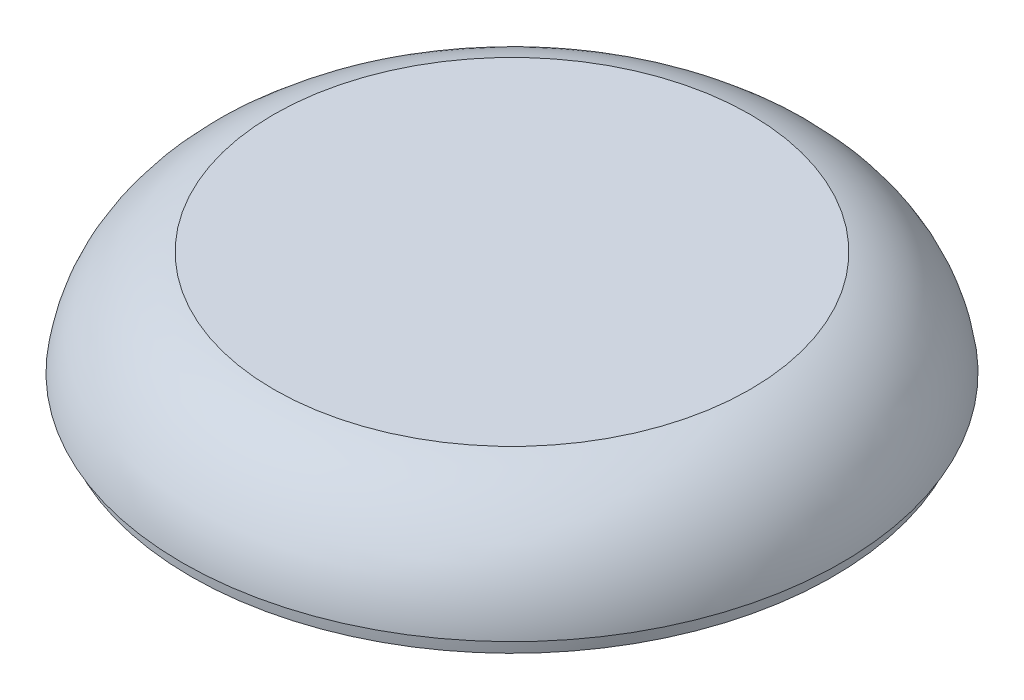
ISO-10303-21;
HEADER;
FILE_DESCRIPTION(('STEP AP214'),'2;1');
FILE_NAME('part.step','',(''),(''),'','','');
FILE_SCHEMA(('AUTOMOTIVE_DESIGN { 1 0 10303 214 1 1 1 1 }'));
ENDSEC;
DATA;
#1=APPLICATION_CONTEXT('core data for automotive mechanical design processes');
#2=APPLICATION_PROTOCOL_DEFINITION('international standard','automotive_design',2000,#1);
#3=PRODUCT_CONTEXT('',#1,'mechanical');
#4=PRODUCT('Part','Part','',(#3));
#5=PRODUCT_RELATED_PRODUCT_CATEGORY('part','',(#4));
#6=PRODUCT_DEFINITION_FORMATION('','',#4);
#7=PRODUCT_DEFINITION_CONTEXT('part definition',#1,'design');
#8=PRODUCT_DEFINITION('design','',#6,#7);
#9=PRODUCT_DEFINITION_SHAPE('','',#8);
#10=(LENGTH_UNIT() NAMED_UNIT(*) SI_UNIT(.MILLI.,.METRE.));
#11=(NAMED_UNIT(*) PLANE_ANGLE_UNIT() SI_UNIT($,.RADIAN.));
#12=(NAMED_UNIT(*) SI_UNIT($,.STERADIAN.) SOLID_ANGLE_UNIT());
#13=UNCERTAINTY_MEASURE_WITH_UNIT(LENGTH_MEASURE(1.E-05),#10,'distance_accuracy_value','');
#14=(GEOMETRIC_REPRESENTATION_CONTEXT(3) GLOBAL_UNCERTAINTY_ASSIGNED_CONTEXT((#13)) GLOBAL_UNIT_ASSIGNED_CONTEXT((#10,
#11,#12)) REPRESENTATION_CONTEXT('',''));
#15=CARTESIAN_POINT('',(0.,0.,0.));
#16=DIRECTION('',(0.,0.,1.));
#17=DIRECTION('',(1.,0.,0.));
#18=AXIS2_PLACEMENT_3D('',#15,#16,#17);
#19=CARTESIAN_POINT('',(41.,-2.,0.));
#20=DIRECTION('',(0.,1.,0.));
#21=DIRECTION('',(0.,0.,1.));
#22=AXIS2_PLACEMENT_3D('',#19,#20,#21);
#23=TOROIDAL_SURFACE('',#22,25.5944940368041,15.5347872203666);
#24=CARTESIAN_POINT('',(41.,0.,0.));
#25=DIRECTION('',(0.,1.,0.));
#26=DIRECTION('',(0.,0.,1.));
#27=AXIS2_PLACEMENT_3D('',#24,#25,#26);
#28=CIRCLE('',#27,41.);
#29=CARTESIAN_POINT('',(41.,0.,41.));
#30=VERTEX_POINT('',#29);
#31=EDGE_CURVE('E10',#30,#30,#28,.T.);
#32=ORIENTED_EDGE('',*,*,#31,.T.);
#33=EDGE_LOOP('',(#32));
#34=FACE_BOUND('',#33,.T.);
#35=CARTESIAN_POINT('',(41.,13.,0.));
#36=DIRECTION('',(0.,1.,0.));
#37=DIRECTION('',(0.,0.,1.));
#38=AXIS2_PLACEMENT_3D('',#35,#36,#37);
#39=CIRCLE('',#38,29.6354857445492);
#40=CARTESIAN_POINT('',(41.,13.,29.6354857445492));
#41=VERTEX_POINT('',#40);
#42=EDGE_CURVE('E70',#41,#41,#39,.T.);
#43=ORIENTED_EDGE('',*,*,#42,.F.);
#44=EDGE_LOOP('',(#43));
#45=FACE_BOUND('',#44,.T.);
#46=ADVANCED_FACE('F39',(#34,#45),#23,.T.);
#47=CARTESIAN_POINT('',(0.,0.,0.));
#48=DIRECTION('',(0.,-1.,0.));
#49=DIRECTION('',(0.,0.,-1.));
#50=AXIS2_PLACEMENT_3D('',#47,#48,#49);
#51=PLANE('',#50);
#52=CARTESIAN_POINT('',(41.,0.,0.));
#53=DIRECTION('',(0.,1.,0.));
#54=DIRECTION('',(0.,0.,1.));
#55=AXIS2_PLACEMENT_3D('',#52,#53,#54);
#56=CIRCLE('',#55,40.);
#57=CARTESIAN_POINT('',(41.,0.,40.));
#58=VERTEX_POINT('',#57);
#59=EDGE_CURVE('E46',#58,#58,#56,.T.);
#60=ORIENTED_EDGE('',*,*,#59,.T.);
#61=EDGE_LOOP('',(#60));
#62=FACE_BOUND('',#61,.T.);
#63=ORIENTED_EDGE('',*,*,#31,.F.);
#64=EDGE_LOOP('',(#63));
#65=FACE_BOUND('',#64,.T.);
#66=ADVANCED_FACE('F78',(#62,#65),#51,.T.);
#67=CARTESIAN_POINT('',(41.,0.,0.));
#68=DIRECTION('',(0.,1.,0.));
#69=DIRECTION('',(-1.,0.,0.));
#70=AXIS2_PLACEMENT_3D('',#67,#68,#69);
#71=SPHERICAL_SURFACE('',#70,40.);
#72=CARTESIAN_POINT('',(41.,-1.99999999999999,0.));
#73=DIRECTION('',(0.,1.,0.));
#74=DIRECTION('',(0.,0.,1.));
#75=AXIS2_PLACEMENT_3D('',#72,#73,#74);
#76=CIRCLE('',#75,39.9499687108764);
#77=CARTESIAN_POINT('',(41.,-1.99999999999999,39.9499687108764));
#78=VERTEX_POINT('',#77);
#79=EDGE_CURVE('E51',#78,#78,#76,.T.);
#80=ORIENTED_EDGE('',*,*,#79,.T.);
#81=EDGE_LOOP('',(#80));
#82=FACE_BOUND('',#81,.T.);
#83=ORIENTED_EDGE('',*,*,#59,.F.);
#84=EDGE_LOOP('',(#83));
#85=FACE_BOUND('',#84,.T.);
#86=ADVANCED_FACE('F82',(#82,#85),#71,.T.);
#87=CARTESIAN_POINT('',(2.05131581169911,-1.99999999999999,0.));
#88=DIRECTION('',(0.,-1.,0.));
#89=DIRECTION('',(0.,0.,-1.));
#90=AXIS2_PLACEMENT_3D('',#87,#88,#89);
#91=PLANE('',#90);
#92=CARTESIAN_POINT('',(41.,-2.,0.));
#93=DIRECTION('',(0.,1.,0.));
#94=DIRECTION('',(0.,0.,1.));
#95=AXIS2_PLACEMENT_3D('',#92,#93,#94);
#96=CIRCLE('',#95,38.9486841883009);
#97=CARTESIAN_POINT('',(41.,-2.,38.9486841883009));
#98=VERTEX_POINT('',#97);
#99=EDGE_CURVE('E56',#98,#98,#96,.T.);
#100=ORIENTED_EDGE('',*,*,#99,.T.);
#101=EDGE_LOOP('',(#100));
#102=FACE_BOUND('',#101,.T.);
#103=ORIENTED_EDGE('',*,*,#79,.F.);
#104=EDGE_LOOP('',(#103));
#105=FACE_BOUND('',#104,.T.);
#106=ADVANCED_FACE('F86',(#102,#105),#91,.T.);
#107=CARTESIAN_POINT('',(41.,0.,0.));
#108=DIRECTION('',(0.,1.,0.));
#109=DIRECTION('',(-1.,0.,0.));
#110=AXIS2_PLACEMENT_3D('',#107,#108,#109);
#111=SPHERICAL_SURFACE('',#110,39.);
#112=CARTESIAN_POINT('',(41.,0.,0.));
#113=DIRECTION('',(0.,1.,0.));
#114=DIRECTION('',(0.,0.,1.));
#115=AXIS2_PLACEMENT_3D('',#112,#113,#114);
#116=CIRCLE('',#115,39.);
#117=CARTESIAN_POINT('',(41.,0.,39.));
#118=VERTEX_POINT('',#117);
#119=EDGE_CURVE('E62',#118,#118,#116,.T.);
#120=ORIENTED_EDGE('',*,*,#119,.T.);
#121=EDGE_LOOP('',(#120));
#122=FACE_BOUND('',#121,.T.);
#123=ORIENTED_EDGE('',*,*,#99,.F.);
#124=EDGE_LOOP('',(#123));
#125=FACE_BOUND('',#124,.T.);
#126=ADVANCED_FACE('F93',(#122,#125),#111,.F.);
#127=CARTESIAN_POINT('',(41.,-2.,0.));
#128=DIRECTION('',(0.,1.,0.));
#129=DIRECTION('',(0.,0.,1.));
#130=AXIS2_PLACEMENT_3D('',#127,#128,#129);
#131=TOROIDAL_SURFACE('',#130,25.5944940368041,13.5538773098063);
#132=CARTESIAN_POINT('',(41.,11.,0.));
#133=DIRECTION('',(0.,1.,0.));
#134=DIRECTION('',(0.,0.,1.));
#135=AXIS2_PLACEMENT_3D('',#132,#133,#134);
#136=CIRCLE('',#135,29.4295416413693);
#137=CARTESIAN_POINT('',(41.,11.,29.4295416413693));
#138=VERTEX_POINT('',#137);
#139=EDGE_CURVE('E66',#138,#138,#136,.T.);
#140=ORIENTED_EDGE('',*,*,#139,.T.);
#141=EDGE_LOOP('',(#140));
#142=FACE_BOUND('',#141,.T.);
#143=ORIENTED_EDGE('',*,*,#119,.F.);
#144=EDGE_LOOP('',(#143));
#145=FACE_BOUND('',#144,.T.);
#146=ADVANCED_FACE('F97',(#142,#145),#131,.F.);
#147=CARTESIAN_POINT('',(41.,11.,0.));
#148=DIRECTION('',(0.,-1.,0.));
#149=DIRECTION('',(0.,0.,-1.));
#150=AXIS2_PLACEMENT_3D('',#147,#148,#149);
#151=PLANE('',#150);
#152=ORIENTED_EDGE('',*,*,#139,.F.);
#153=EDGE_LOOP('',(#152));
#154=FACE_BOUND('',#153,.T.);
#155=ADVANCED_FACE('F101',(#154),#151,.T.);
#156=CARTESIAN_POINT('',(11.3645142554508,13.,0.));
#157=DIRECTION('',(0.,1.,0.));
#158=DIRECTION('',(0.,0.,1.));
#159=AXIS2_PLACEMENT_3D('',#156,#157,#158);
#160=PLANE('',#159);
#161=ORIENTED_EDGE('',*,*,#42,.T.);
#162=EDGE_LOOP('',(#161));
#163=FACE_BOUND('',#162,.T.);
#164=ADVANCED_FACE('F75',(#163),#160,.T.);
#165=CLOSED_SHELL('',(#46,#66,#86,#106,#126,#146,#155,#164));
#166=MANIFOLD_SOLID_BREP('B2',#165);
#167=ADVANCED_BREP_SHAPE_REPRESENTATION('',(#18,#166),#14);
#168=SHAPE_DEFINITION_REPRESENTATION(#9,#167);
ENDSEC;
END-ISO-10303-21;
